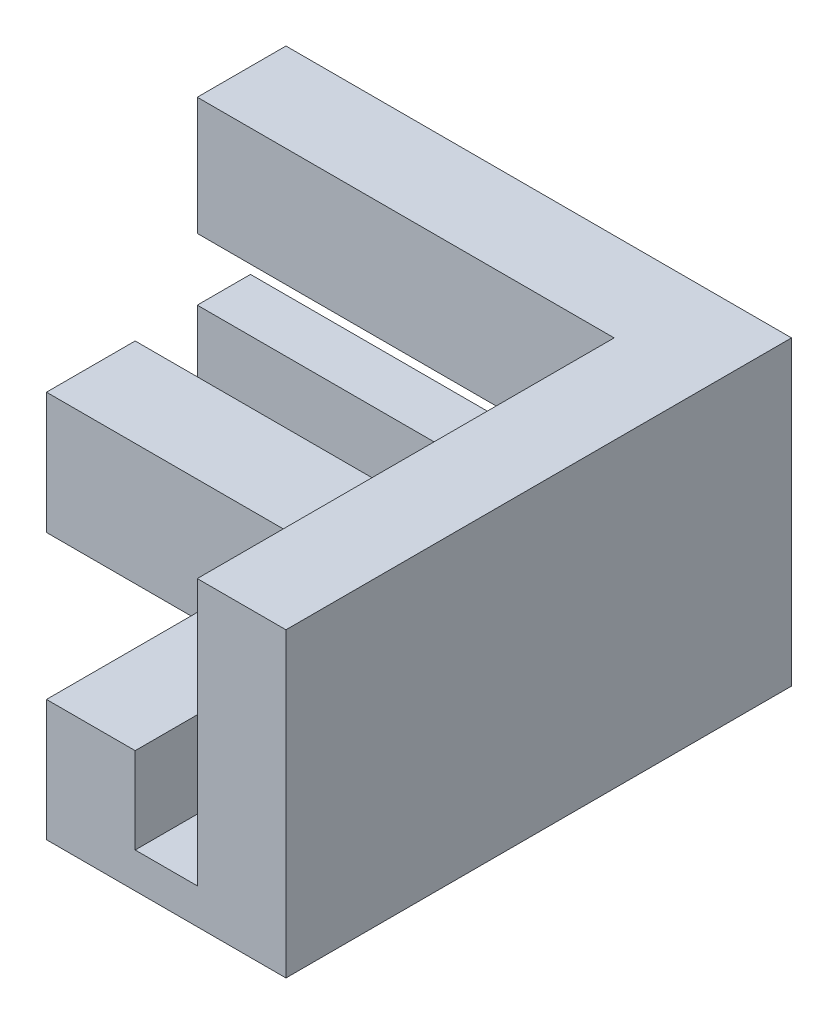
ISO-10303-21;
HEADER;
FILE_DESCRIPTION(('STEP AP214'),'2;1');
FILE_NAME('part.step','',(''),(''),'','','');
FILE_SCHEMA(('AUTOMOTIVE_DESIGN { 1 0 10303 214 1 1 1 1 }'));
ENDSEC;
DATA;
#1=APPLICATION_CONTEXT('core data for automotive mechanical design processes');
#2=APPLICATION_PROTOCOL_DEFINITION('international standard','automotive_design',2000,#1);
#3=PRODUCT_CONTEXT('',#1,'mechanical');
#4=PRODUCT('Part','Part','',(#3));
#5=PRODUCT_RELATED_PRODUCT_CATEGORY('part','',(#4));
#6=PRODUCT_DEFINITION_FORMATION('','',#4);
#7=PRODUCT_DEFINITION_CONTEXT('part definition',#1,'design');
#8=PRODUCT_DEFINITION('design','',#6,#7);
#9=PRODUCT_DEFINITION_SHAPE('','',#8);
#10=(LENGTH_UNIT() NAMED_UNIT(*) SI_UNIT(.MILLI.,.METRE.));
#11=(NAMED_UNIT(*) PLANE_ANGLE_UNIT() SI_UNIT($,.RADIAN.));
#12=(NAMED_UNIT(*) SI_UNIT($,.STERADIAN.) SOLID_ANGLE_UNIT());
#13=UNCERTAINTY_MEASURE_WITH_UNIT(LENGTH_MEASURE(1.E-05),#10,'distance_accuracy_value','');
#14=(GEOMETRIC_REPRESENTATION_CONTEXT(3) GLOBAL_UNCERTAINTY_ASSIGNED_CONTEXT((#13)) GLOBAL_UNIT_ASSIGNED_CONTEXT((#10,
#11,#12)) REPRESENTATION_CONTEXT('',''));
#15=CARTESIAN_POINT('',(0.,0.,0.));
#16=DIRECTION('',(0.,0.,1.));
#17=DIRECTION('',(1.,0.,0.));
#18=AXIS2_PLACEMENT_3D('',#15,#16,#17);
#19=CARTESIAN_POINT('',(-5.,15.,-9.39173583771506));
#20=DIRECTION('',(1.,0.,0.));
#21=DIRECTION('',(0.,0.,-1.));
#22=AXIS2_PLACEMENT_3D('',#19,#20,#21);
#23=PLANE('',#22);
#24=DIRECTION('',(0.,-1.,0.));
#25=VECTOR('',#24,1.);
#26=CARTESIAN_POINT('',(-5.,15.,-9.39173583771506));
#27=LINE('',#26,#25);
#28=CARTESIAN_POINT('',(-5.,15.,-9.39173583771506));
#29=VERTEX_POINT('',#28);
#30=CARTESIAN_POINT('',(-5.,10.35,-9.39173583771506));
#31=VERTEX_POINT('',#30);
#32=EDGE_CURVE('E239',#29,#31,#27,.T.);
#33=ORIENTED_EDGE('',*,*,#32,.T.);
#34=DIRECTION('',(0.,0.707106781186546,-0.707106781186549));
#35=VECTOR('',#34,1.);
#36=CARTESIAN_POINT('',(-5.,10.35,-9.39173583771506));
#37=LINE('',#36,#35);
#38=CARTESIAN_POINT('',(-5.,8.35,-7.39173583771505));
#39=VERTEX_POINT('',#38);
#40=EDGE_CURVE('E69',#31,#39,#37,.F.);
#41=ORIENTED_EDGE('',*,*,#40,.T.);
#42=DIRECTION('',(0.,0.,1.));
#43=VECTOR('',#42,1.);
#44=CARTESIAN_POINT('',(-5.,8.35,-9.39173583771506));
#45=LINE('',#44,#43);
#46=CARTESIAN_POINT('',(-5.,8.35,-4.39173583771506));
#47=VERTEX_POINT('',#46);
#48=EDGE_CURVE('E372',#39,#47,#45,.T.);
#49=ORIENTED_EDGE('',*,*,#48,.T.);
#50=DIRECTION('',(0.,1.,0.));
#51=VECTOR('',#50,1.);
#52=CARTESIAN_POINT('',(-5.,-33.2340187157677,-4.39173583771506));
#53=LINE('',#52,#51);
#54=CARTESIAN_POINT('',(-5.,15.,-4.39173583771506));
#55=VERTEX_POINT('',#54);
#56=EDGE_CURVE('E346',#47,#55,#53,.T.);
#57=ORIENTED_EDGE('',*,*,#56,.T.);
#58=DIRECTION('',(0.,0.,1.));
#59=VECTOR('',#58,1.);
#60=CARTESIAN_POINT('',(-5.,15.,-9.39173583771506));
#61=LINE('',#60,#59);
#62=EDGE_CURVE('E219',#29,#55,#61,.T.);
#63=ORIENTED_EDGE('',*,*,#62,.F.);
#64=EDGE_LOOP('',(#33,#41,#49,#57,#63));
#65=FACE_BOUND('',#64,.T.);
#66=ADVANCED_FACE('F44',(#65),#23,.F.);
#67=CARTESIAN_POINT('',(18.5,15.,-4.39173583771506));
#68=DIRECTION('',(0.,0.,1.));
#69=DIRECTION('',(1.,0.,0.));
#70=AXIS2_PLACEMENT_3D('',#67,#68,#69);
#71=PLANE('',#70);
#72=DIRECTION('',(-1.,0.,0.));
#73=VECTOR('',#72,1.);
#74=CARTESIAN_POINT('',(18.5,8.35,-4.39173583771506));
#75=LINE('',#74,#73);
#76=CARTESIAN_POINT('',(18.5,8.35,-4.39173583771506));
#77=VERTEX_POINT('',#76);
#78=EDGE_CURVE('E383',#77,#47,#75,.T.);
#79=ORIENTED_EDGE('',*,*,#78,.F.);
#80=DIRECTION('',(0.,-1.,0.));
#81=VECTOR('',#80,1.);
#82=CARTESIAN_POINT('',(18.5,15.,-4.39173583771506));
#83=LINE('',#82,#81);
#84=CARTESIAN_POINT('',(18.5,15.,-4.39173583771506));
#85=VERTEX_POINT('',#84);
#86=EDGE_CURVE('E197',#85,#77,#83,.T.);
#87=ORIENTED_EDGE('',*,*,#86,.F.);
#88=DIRECTION('',(-1.,0.,0.));
#89=VECTOR('',#88,1.);
#90=CARTESIAN_POINT('',(18.5,15.,-4.39173583771506));
#91=LINE('',#90,#89);
#92=EDGE_CURVE('E204',#85,#55,#91,.T.);
#93=ORIENTED_EDGE('',*,*,#92,.T.);
#94=ORIENTED_EDGE('',*,*,#56,.F.);
#95=EDGE_LOOP('',(#79,#87,#93,#94));
#96=FACE_BOUND('',#95,.T.);
#97=ADVANCED_FACE('F403',(#96),#71,.T.);
#98=CARTESIAN_POINT('',(-5.,15.,4.10826416228494));
#99=DIRECTION('',(0.,0.,-1.));
#100=DIRECTION('',(-1.,0.,0.));
#101=AXIS2_PLACEMENT_3D('',#98,#99,#100);
#102=PLANE('',#101);
#103=DIRECTION('',(-1.,0.,0.));
#104=VECTOR('',#103,1.);
#105=CARTESIAN_POINT('',(-5.,4.85,4.10826416228494));
#106=LINE('',#105,#104);
#107=CARTESIAN_POINT('',(10.,4.85,4.10826416228494));
#108=VERTEX_POINT('',#107);
#109=CARTESIAN_POINT('',(-5.,4.85,4.10826416228494));
#110=VERTEX_POINT('',#109);
#111=EDGE_CURVE('E344',#108,#110,#106,.T.);
#112=ORIENTED_EDGE('',*,*,#111,.T.);
#113=DIRECTION('',(0.,-1.,0.));
#114=VECTOR('',#113,1.);
#115=CARTESIAN_POINT('',(-5.,15.,4.10826416228494));
#116=LINE('',#115,#114);
#117=CARTESIAN_POINT('',(-5.,-2.,4.10826416228494));
#118=VERTEX_POINT('',#117);
#119=EDGE_CURVE('E235',#110,#118,#116,.T.);
#120=ORIENTED_EDGE('',*,*,#119,.T.);
#121=DIRECTION('',(-1.,0.,0.));
#122=VECTOR('',#121,1.);
#123=CARTESIAN_POINT('',(-5.,-2.,4.10826416228494));
#124=LINE('',#123,#122);
#125=CARTESIAN_POINT('',(10.,-2.,4.10826416228494));
#126=VERTEX_POINT('',#125);
#127=EDGE_CURVE('E289',#126,#118,#124,.T.);
#128=ORIENTED_EDGE('',*,*,#127,.F.);
#129=DIRECTION('',(0.,-1.,0.));
#130=VECTOR('',#129,1.);
#131=CARTESIAN_POINT('',(10.,15.,4.10826416228494));
#132=LINE('',#131,#130);
#133=EDGE_CURVE('E232',#108,#126,#132,.T.);
#134=ORIENTED_EDGE('',*,*,#133,.F.);
#135=EDGE_LOOP('',(#112,#120,#128,#134));
#136=FACE_BOUND('',#135,.T.);
#137=ADVANCED_FACE('F408',(#136),#102,.F.);
#138=CARTESIAN_POINT('',(10.,15.,4.10826416228494));
#139=DIRECTION('',(1.,0.,0.));
#140=DIRECTION('',(0.,0.,-1.));
#141=AXIS2_PLACEMENT_3D('',#138,#139,#140);
#142=PLANE('',#141);
#143=DIRECTION('',(0.,0.,-1.));
#144=VECTOR('',#143,1.);
#145=CARTESIAN_POINT('',(10.,4.85,4.10826416228494));
#146=LINE('',#145,#144);
#147=CARTESIAN_POINT('',(10.,4.85,19.1082641622849));
#148=VERTEX_POINT('',#147);
#149=EDGE_CURVE('E355',#148,#108,#146,.T.);
#150=ORIENTED_EDGE('',*,*,#149,.T.);
#151=ORIENTED_EDGE('',*,*,#133,.T.);
#152=DIRECTION('',(0.,0.,-1.));
#153=VECTOR('',#152,1.);
#154=CARTESIAN_POINT('',(10.,-2.,4.10826416228494));
#155=LINE('',#154,#153);
#156=CARTESIAN_POINT('',(10.,-2.,19.1082641622849));
#157=VERTEX_POINT('',#156);
#158=EDGE_CURVE('E305',#157,#126,#155,.T.);
#159=ORIENTED_EDGE('',*,*,#158,.F.);
#160=DIRECTION('',(0.,-1.,0.));
#161=VECTOR('',#160,1.);
#162=CARTESIAN_POINT('',(10.,15.,19.1082641622849));
#163=LINE('',#162,#161);
#164=EDGE_CURVE('E229',#148,#157,#163,.T.);
#165=ORIENTED_EDGE('',*,*,#164,.F.);
#166=EDGE_LOOP('',(#150,#151,#159,#165));
#167=FACE_BOUND('',#166,.T.);
#168=ADVANCED_FACE('F440',(#167),#142,.F.);
#169=CARTESIAN_POINT('',(0.,15.,-0.891735837715059));
#170=DIRECTION('',(0.,0.,-1.));
#171=DIRECTION('',(-1.,0.,0.));
#172=AXIS2_PLACEMENT_3D('',#169,#170,#171);
#173=PLANE('',#172);
#174=DIRECTION('',(1.,0.,0.));
#175=VECTOR('',#174,1.);
#176=CARTESIAN_POINT('',(0.,0.,-0.891735837715059));
#177=LINE('',#176,#175);
#178=CARTESIAN_POINT('',(-5.,0.,-0.891735837715057));
#179=VERTEX_POINT('',#178);
#180=CARTESIAN_POINT('',(15.,0.,-0.891735837715059));
#181=VERTEX_POINT('',#180);
#182=EDGE_CURVE('E315',#179,#181,#177,.T.);
#183=ORIENTED_EDGE('',*,*,#182,.F.);
#184=DIRECTION('',(0.,1.,0.));
#185=VECTOR('',#184,1.);
#186=CARTESIAN_POINT('',(-5.,-33.2340187157677,-0.891735837715057));
#187=LINE('',#186,#185);
#188=CARTESIAN_POINT('',(-5.,4.85,-0.891735837715058));
#189=VERTEX_POINT('',#188);
#190=EDGE_CURVE('E367',#179,#189,#187,.T.);
#191=ORIENTED_EDGE('',*,*,#190,.T.);
#192=DIRECTION('',(1.,0.,0.));
#193=VECTOR('',#192,1.);
#194=CARTESIAN_POINT('',(0.,4.85,-0.891735837715059));
#195=LINE('',#194,#193);
#196=CARTESIAN_POINT('',(15.,4.85,-0.891735837715059));
#197=VERTEX_POINT('',#196);
#198=EDGE_CURVE('E291',#189,#197,#195,.T.);
#199=ORIENTED_EDGE('',*,*,#198,.T.);
#200=DIRECTION('',(0.,-1.,0.));
#201=VECTOR('',#200,1.);
#202=CARTESIAN_POINT('',(15.,15.,-0.891735837715059));
#203=LINE('',#202,#201);
#204=EDGE_CURVE('E203',#197,#181,#203,.T.);
#205=ORIENTED_EDGE('',*,*,#204,.T.);
#206=EDGE_LOOP('',(#183,#191,#199,#205));
#207=FACE_BOUND('',#206,.T.);
#208=ADVANCED_FACE('F446',(#207),#173,.T.);
#209=CARTESIAN_POINT('',(15.,15.,-0.891735837715059));
#210=DIRECTION('',(1.,0.,0.));
#211=DIRECTION('',(0.,0.,-1.));
#212=AXIS2_PLACEMENT_3D('',#209,#210,#211);
#213=PLANE('',#212);
#214=ORIENTED_EDGE('',*,*,#204,.F.);
#215=DIRECTION('',(0.,0.,1.));
#216=VECTOR('',#215,1.);
#217=CARTESIAN_POINT('',(15.,4.85,-0.891735837715059));
#218=LINE('',#217,#216);
#219=CARTESIAN_POINT('',(15.,4.85,19.1082641622849));
#220=VERTEX_POINT('',#219);
#221=EDGE_CURVE('E295',#197,#220,#218,.T.);
#222=ORIENTED_EDGE('',*,*,#221,.T.);
#223=DIRECTION('',(0.,1.,0.));
#224=VECTOR('',#223,1.);
#225=CARTESIAN_POINT('',(15.,-33.2340187157677,19.1082641622849));
#226=LINE('',#225,#224);
#227=CARTESIAN_POINT('',(15.,0.,19.1082641622849));
#228=VERTEX_POINT('',#227);
#229=EDGE_CURVE('E371',#228,#220,#226,.T.);
#230=ORIENTED_EDGE('',*,*,#229,.F.);
#231=DIRECTION('',(0.,0.,1.));
#232=VECTOR('',#231,1.);
#233=CARTESIAN_POINT('',(15.,0.,-0.891735837715059));
#234=LINE('',#233,#232);
#235=EDGE_CURVE('E318',#181,#228,#234,.T.);
#236=ORIENTED_EDGE('',*,*,#235,.F.);
#237=EDGE_LOOP('',(#214,#222,#230,#236));
#238=FACE_BOUND('',#237,.T.);
#239=ADVANCED_FACE('F434',(#238),#213,.T.);
#240=CARTESIAN_POINT('',(0.,15.,0.));
#241=DIRECTION('',(0.,1.,0.));
#242=DIRECTION('',(0.,0.,1.));
#243=AXIS2_PLACEMENT_3D('',#240,#241,#242);
#244=PLANE('',#243);
#245=DIRECTION('',(0.,0.,-1.));
#246=VECTOR('',#245,1.);
#247=CARTESIAN_POINT('',(18.5,15.,14.1082641622849));
#248=LINE('',#247,#246);
#249=CARTESIAN_POINT('',(18.5,15.,19.1082641622849));
#250=VERTEX_POINT('',#249);
#251=EDGE_CURVE('E198',#250,#85,#248,.T.);
#252=ORIENTED_EDGE('',*,*,#251,.F.);
#253=DIRECTION('',(1.,0.,0.));
#254=VECTOR('',#253,1.);
#255=CARTESIAN_POINT('',(10.,15.,19.1082641622849));
#256=LINE('',#255,#254);
#257=CARTESIAN_POINT('',(23.5,15.,19.1082641622849));
#258=VERTEX_POINT('',#257);
#259=EDGE_CURVE('E223',#250,#258,#256,.T.);
#260=ORIENTED_EDGE('',*,*,#259,.T.);
#261=DIRECTION('',(0.,0.,-1.));
#262=VECTOR('',#261,1.);
#263=CARTESIAN_POINT('',(23.5,15.,19.1082641622849));
#264=LINE('',#263,#262);
#265=CARTESIAN_POINT('',(23.5,15.,-9.39173583771506));
#266=VERTEX_POINT('',#265);
#267=EDGE_CURVE('E212',#258,#266,#264,.T.);
#268=ORIENTED_EDGE('',*,*,#267,.T.);
#269=DIRECTION('',(-1.,0.,0.));
#270=VECTOR('',#269,1.);
#271=CARTESIAN_POINT('',(23.5,15.,-9.39173583771506));
#272=LINE('',#271,#270);
#273=EDGE_CURVE('E216',#266,#29,#272,.T.);
#274=ORIENTED_EDGE('',*,*,#273,.T.);
#275=ORIENTED_EDGE('',*,*,#62,.T.);
#276=ORIENTED_EDGE('',*,*,#92,.F.);
#277=EDGE_LOOP('',(#252,#260,#268,#274,#275,#276));
#278=FACE_BOUND('',#277,.T.);
#279=ADVANCED_FACE('F423',(#278),#244,.T.);
#280=CARTESIAN_POINT('',(23.5,15.,19.1082641622849));
#281=DIRECTION('',(-1.,0.,0.));
#282=DIRECTION('',(0.,0.,1.));
#283=AXIS2_PLACEMENT_3D('',#280,#281,#282);
#284=PLANE('',#283);
#285=DIRECTION('',(0.,-1.,0.));
#286=VECTOR('',#285,1.);
#287=CARTESIAN_POINT('',(23.5,15.,19.1082641622849));
#288=LINE('',#287,#286);
#289=CARTESIAN_POINT('',(23.5,-2.,19.1082641622849));
#290=VERTEX_POINT('',#289);
#291=EDGE_CURVE('E226',#258,#290,#288,.T.);
#292=ORIENTED_EDGE('',*,*,#291,.T.);
#293=DIRECTION('',(0.,0.,1.));
#294=VECTOR('',#293,1.);
#295=CARTESIAN_POINT('',(23.5,-2.,19.1082641622849));
#296=LINE('',#295,#294);
#297=CARTESIAN_POINT('',(23.5,-2.,-9.39173583771506));
#298=VERTEX_POINT('',#297);
#299=EDGE_CURVE('E283',#298,#290,#296,.T.);
#300=ORIENTED_EDGE('',*,*,#299,.F.);
#301=DIRECTION('',(0.,-1.,0.));
#302=VECTOR('',#301,1.);
#303=CARTESIAN_POINT('',(23.5,15.,-9.39173583771506));
#304=LINE('',#303,#302);
#305=EDGE_CURVE('E242',#266,#298,#304,.T.);
#306=ORIENTED_EDGE('',*,*,#305,.F.);
#307=ORIENTED_EDGE('',*,*,#267,.F.);
#308=EDGE_LOOP('',(#292,#300,#306,#307));
#309=FACE_BOUND('',#308,.T.);
#310=ADVANCED_FACE('F419',(#309),#284,.F.);
#311=CARTESIAN_POINT('',(23.5,15.,-9.39173583771506));
#312=DIRECTION('',(0.,0.,1.));
#313=DIRECTION('',(1.,0.,0.));
#314=AXIS2_PLACEMENT_3D('',#311,#312,#313);
#315=PLANE('',#314);
#316=CARTESIAN_POINT('',(-5.,2.84999999999999,-9.39173583771506));
#317=VERTEX_POINT('',#316);
#318=CARTESIAN_POINT('',(-5.,-2.,-9.39173583771506));
#319=VERTEX_POINT('',#318);
#320=EDGE_CURVE('E238',#317,#319,#27,.T.);
#321=ORIENTED_EDGE('',*,*,#320,.F.);
#322=DIRECTION('',(1.,0.,0.));
#323=VECTOR('',#322,1.);
#324=CARTESIAN_POINT('',(23.5,2.84999999999999,-9.39173583771506));
#325=LINE('',#324,#323);
#326=CARTESIAN_POINT('',(18.5,2.85,-9.39173583771506));
#327=VERTEX_POINT('',#326);
#328=EDGE_CURVE('E249',#317,#327,#325,.T.);
#329=ORIENTED_EDGE('',*,*,#328,.T.);
#330=DIRECTION('',(0.,1.,0.));
#331=VECTOR('',#330,1.);
#332=CARTESIAN_POINT('',(18.5,4.85,-9.39173583771506));
#333=LINE('',#332,#331);
#334=CARTESIAN_POINT('',(18.5,10.35,-9.39173583771506));
#335=VERTEX_POINT('',#334);
#336=EDGE_CURVE('E181',#327,#335,#333,.T.);
#337=ORIENTED_EDGE('',*,*,#336,.T.);
#338=DIRECTION('',(-1.,0.,0.));
#339=VECTOR('',#338,1.);
#340=CARTESIAN_POINT('',(23.5,10.35,-9.39173583771506));
#341=LINE('',#340,#339);
#342=EDGE_CURVE('E245',#335,#31,#341,.T.);
#343=ORIENTED_EDGE('',*,*,#342,.T.);
#344=ORIENTED_EDGE('',*,*,#32,.F.);
#345=ORIENTED_EDGE('',*,*,#273,.F.);
#346=ORIENTED_EDGE('',*,*,#305,.T.);
#347=DIRECTION('',(1.,0.,0.));
#348=VECTOR('',#347,1.);
#349=CARTESIAN_POINT('',(23.5,-2.,-9.39173583771506));
#350=LINE('',#349,#348);
#351=EDGE_CURVE('E276',#319,#298,#350,.T.);
#352=ORIENTED_EDGE('',*,*,#351,.F.);
#353=EDGE_LOOP('',(#321,#329,#337,#343,#344,#345,#346,#352));
#354=FACE_BOUND('',#353,.T.);
#355=ADVANCED_FACE('F277',(#354),#315,.F.);
#356=DIRECTION('',(0.,0.,-1.));
#357=VECTOR('',#356,1.);
#358=CARTESIAN_POINT('',(-5.,4.85,-9.39173583771506));
#359=LINE('',#358,#357);
#360=CARTESIAN_POINT('',(-5.,4.85,-4.39173583771506));
#361=VERTEX_POINT('',#360);
#362=CARTESIAN_POINT('',(-5.,4.85,-7.39173583771505));
#363=VERTEX_POINT('',#362);
#364=EDGE_CURVE('E187',#361,#363,#359,.T.);
#365=ORIENTED_EDGE('',*,*,#364,.T.);
#366=DIRECTION('',(0.,0.707106781186546,0.707106781186549));
#367=VECTOR('',#366,1.);
#368=CARTESIAN_POINT('',(-5.,2.84999999999999,-9.39173583771506));
#369=LINE('',#368,#367);
#370=EDGE_CURVE('E256',#363,#317,#369,.F.);
#371=ORIENTED_EDGE('',*,*,#370,.T.);
#372=ORIENTED_EDGE('',*,*,#320,.T.);
#373=DIRECTION('',(0.,0.,-1.));
#374=VECTOR('',#373,1.);
#375=CARTESIAN_POINT('',(-5.,-2.,-9.39173583771506));
#376=LINE('',#375,#374);
#377=EDGE_CURVE('E271',#118,#319,#376,.T.);
#378=ORIENTED_EDGE('',*,*,#377,.F.);
#379=ORIENTED_EDGE('',*,*,#119,.F.);
#380=DIRECTION('',(0.,0.,-1.));
#381=VECTOR('',#380,1.);
#382=CARTESIAN_POINT('',(-5.,4.85,-0.891735837715059));
#383=LINE('',#382,#381);
#384=EDGE_CURVE('E338',#110,#189,#383,.T.);
#385=ORIENTED_EDGE('',*,*,#384,.T.);
#386=ORIENTED_EDGE('',*,*,#190,.F.);
#387=DIRECTION('',(0.,0.,-1.));
#388=VECTOR('',#387,1.);
#389=CARTESIAN_POINT('',(-5.,0.,-0.891735837715057));
#390=LINE('',#389,#388);
#391=CARTESIAN_POINT('',(-5.,0.,-4.39173583771506));
#392=VERTEX_POINT('',#391);
#393=EDGE_CURVE('E375',#179,#392,#390,.T.);
#394=ORIENTED_EDGE('',*,*,#393,.T.);
#395=EDGE_CURVE('E339',#392,#361,#53,.T.);
#396=ORIENTED_EDGE('',*,*,#395,.T.);
#397=EDGE_LOOP('',(#365,#371,#372,#378,#379,#385,#386,#394,#396));
#398=FACE_BOUND('',#397,.T.);
#399=ADVANCED_FACE('F268',(#398),#23,.F.);
#400=CARTESIAN_POINT('',(10.,15.,19.1082641622849));
#401=DIRECTION('',(0.,0.,-1.));
#402=DIRECTION('',(-1.,0.,0.));
#403=AXIS2_PLACEMENT_3D('',#400,#401,#402);
#404=PLANE('',#403);
#405=DIRECTION('',(0.,1.,0.));
#406=VECTOR('',#405,1.);
#407=CARTESIAN_POINT('',(18.5,-33.2340187157677,19.1082641622849));
#408=LINE('',#407,#406);
#409=CARTESIAN_POINT('',(18.5,0.,19.1082641622849));
#410=VERTEX_POINT('',#409);
#411=EDGE_CURVE('E330',#410,#250,#408,.T.);
#412=ORIENTED_EDGE('',*,*,#411,.F.);
#413=DIRECTION('',(-1.,0.,0.));
#414=VECTOR('',#413,1.);
#415=CARTESIAN_POINT('',(18.5,0.,19.1082641622849));
#416=LINE('',#415,#414);
#417=EDGE_CURVE('E328',#410,#228,#416,.T.);
#418=ORIENTED_EDGE('',*,*,#417,.T.);
#419=ORIENTED_EDGE('',*,*,#229,.T.);
#420=DIRECTION('',(-1.,0.,0.));
#421=VECTOR('',#420,1.);
#422=CARTESIAN_POINT('',(15.,4.85,19.1082641622849));
#423=LINE('',#422,#421);
#424=EDGE_CURVE('E349',#220,#148,#423,.T.);
#425=ORIENTED_EDGE('',*,*,#424,.T.);
#426=ORIENTED_EDGE('',*,*,#164,.T.);
#427=DIRECTION('',(-1.,0.,0.));
#428=VECTOR('',#427,1.);
#429=CARTESIAN_POINT('',(10.,-2.,19.1082641622849));
#430=LINE('',#429,#428);
#431=EDGE_CURVE('E301',#290,#157,#430,.T.);
#432=ORIENTED_EDGE('',*,*,#431,.F.);
#433=ORIENTED_EDGE('',*,*,#291,.F.);
#434=ORIENTED_EDGE('',*,*,#259,.F.);
#435=EDGE_LOOP('',(#412,#418,#419,#425,#426,#432,#433,#434));
#436=FACE_BOUND('',#435,.T.);
#437=ADVANCED_FACE('F334',(#436),#404,.F.);
#438=DIRECTION('',(1.,0.,0.));
#439=VECTOR('',#438,1.);
#440=CARTESIAN_POINT('',(18.5,4.85,-4.39173583771506));
#441=LINE('',#440,#439);
#442=CARTESIAN_POINT('',(18.5,4.85,-4.39173583771506));
#443=VERTEX_POINT('',#442);
#444=EDGE_CURVE('E184',#361,#443,#441,.T.);
#445=ORIENTED_EDGE('',*,*,#444,.F.);
#446=ORIENTED_EDGE('',*,*,#395,.F.);
#447=DIRECTION('',(-1.,0.,0.));
#448=VECTOR('',#447,1.);
#449=CARTESIAN_POINT('',(18.5,0.,-4.39173583771506));
#450=LINE('',#449,#448);
#451=CARTESIAN_POINT('',(18.5,0.,-4.39173583771506));
#452=VERTEX_POINT('',#451);
#453=EDGE_CURVE('E194',#452,#392,#450,.T.);
#454=ORIENTED_EDGE('',*,*,#453,.F.);
#455=EDGE_CURVE('E174',#443,#452,#83,.T.);
#456=ORIENTED_EDGE('',*,*,#455,.F.);
#457=EDGE_LOOP('',(#445,#446,#454,#456));
#458=FACE_BOUND('',#457,.T.);
#459=ADVANCED_FACE('F193',(#458),#71,.T.);
#460=CARTESIAN_POINT('',(18.5,15.,14.1082641622849));
#461=DIRECTION('',(-1.,0.,0.));
#462=DIRECTION('',(0.,0.,1.));
#463=AXIS2_PLACEMENT_3D('',#460,#461,#462);
#464=PLANE('',#463);
#465=ORIENTED_EDGE('',*,*,#411,.T.);
#466=ORIENTED_EDGE('',*,*,#251,.T.);
#467=ORIENTED_EDGE('',*,*,#86,.T.);
#468=DIRECTION('',(0.,0.,1.));
#469=VECTOR('',#468,1.);
#470=CARTESIAN_POINT('',(18.5,8.35,-9.39173583771506));
#471=LINE('',#470,#469);
#472=CARTESIAN_POINT('',(18.5,8.35,-7.39173583771505));
#473=VERTEX_POINT('',#472);
#474=EDGE_CURVE('E180',#473,#77,#471,.T.);
#475=ORIENTED_EDGE('',*,*,#474,.F.);
#476=DIRECTION('',(0.,-0.707106781186546,0.707106781186549));
#477=VECTOR('',#476,1.);
#478=CARTESIAN_POINT('',(18.5,10.35,-9.39173583771506));
#479=LINE('',#478,#477);
#480=EDGE_CURVE('E13',#473,#335,#479,.F.);
#481=ORIENTED_EDGE('',*,*,#480,.T.);
#482=ORIENTED_EDGE('',*,*,#336,.F.);
#483=DIRECTION('',(0.,-0.707106781186546,-0.707106781186549));
#484=VECTOR('',#483,1.);
#485=CARTESIAN_POINT('',(18.5,2.84999999999999,-9.39173583771506));
#486=LINE('',#485,#484);
#487=CARTESIAN_POINT('',(18.5,4.85,-7.39173583771505));
#488=VERTEX_POINT('',#487);
#489=EDGE_CURVE('E54',#327,#488,#486,.F.);
#490=ORIENTED_EDGE('',*,*,#489,.T.);
#491=DIRECTION('',(0.,0.,1.));
#492=VECTOR('',#491,1.);
#493=CARTESIAN_POINT('',(18.5,4.85,-9.39173583771506));
#494=LINE('',#493,#492);
#495=EDGE_CURVE('E170',#488,#443,#494,.T.);
#496=ORIENTED_EDGE('',*,*,#495,.T.);
#497=ORIENTED_EDGE('',*,*,#455,.T.);
#498=DIRECTION('',(0.,0.,-1.));
#499=VECTOR('',#498,1.);
#500=CARTESIAN_POINT('',(18.5,0.,14.1082641622849));
#501=LINE('',#500,#499);
#502=EDGE_CURVE('E208',#410,#452,#501,.T.);
#503=ORIENTED_EDGE('',*,*,#502,.F.);
#504=EDGE_LOOP('',(#465,#466,#467,#475,#481,#482,#490,#496,#497,#503));
#505=FACE_BOUND('',#504,.T.);
#506=ADVANCED_FACE('F172',(#505),#464,.T.);
#507=CARTESIAN_POINT('',(0.,0.,0.));
#508=DIRECTION('',(0.,1.,0.));
#509=DIRECTION('',(0.,0.,1.));
#510=AXIS2_PLACEMENT_3D('',#507,#508,#509);
#511=PLANE('',#510);
#512=ORIENTED_EDGE('',*,*,#502,.T.);
#513=ORIENTED_EDGE('',*,*,#453,.T.);
#514=ORIENTED_EDGE('',*,*,#393,.F.);
#515=ORIENTED_EDGE('',*,*,#182,.T.);
#516=ORIENTED_EDGE('',*,*,#235,.T.);
#517=ORIENTED_EDGE('',*,*,#417,.F.);
#518=EDGE_LOOP('',(#512,#513,#514,#515,#516,#517));
#519=FACE_BOUND('',#518,.T.);
#520=ADVANCED_FACE('F325',(#519),#511,.T.);
#521=CARTESIAN_POINT('',(0.,-2.,0.));
#522=DIRECTION('',(0.,1.,0.));
#523=DIRECTION('',(0.,0.,1.));
#524=AXIS2_PLACEMENT_3D('',#521,#522,#523);
#525=PLANE('',#524);
#526=ORIENTED_EDGE('',*,*,#377,.T.);
#527=ORIENTED_EDGE('',*,*,#351,.T.);
#528=ORIENTED_EDGE('',*,*,#299,.T.);
#529=ORIENTED_EDGE('',*,*,#431,.T.);
#530=ORIENTED_EDGE('',*,*,#158,.T.);
#531=ORIENTED_EDGE('',*,*,#127,.T.);
#532=EDGE_LOOP('',(#526,#527,#528,#529,#530,#531));
#533=FACE_BOUND('',#532,.T.);
#534=ADVANCED_FACE('F286',(#533),#525,.F.);
#535=CARTESIAN_POINT('',(0.,4.85,0.));
#536=DIRECTION('',(0.,1.,0.));
#537=DIRECTION('',(0.,0.,1.));
#538=AXIS2_PLACEMENT_3D('',#535,#536,#537);
#539=PLANE('',#538);
#540=ORIENTED_EDGE('',*,*,#424,.F.);
#541=ORIENTED_EDGE('',*,*,#221,.F.);
#542=ORIENTED_EDGE('',*,*,#198,.F.);
#543=ORIENTED_EDGE('',*,*,#384,.F.);
#544=ORIENTED_EDGE('',*,*,#111,.F.);
#545=ORIENTED_EDGE('',*,*,#149,.F.);
#546=EDGE_LOOP('',(#540,#541,#542,#543,#544,#545));
#547=FACE_BOUND('',#546,.T.);
#548=ADVANCED_FACE('F444',(#547),#539,.T.);
#549=CARTESIAN_POINT('',(18.5,8.35,-9.39173583771506));
#550=DIRECTION('',(0.,1.,0.));
#551=DIRECTION('',(-1.,0.,0.));
#552=AXIS2_PLACEMENT_3D('',#549,#550,#551);
#553=PLANE('',#552);
#554=ORIENTED_EDGE('',*,*,#48,.F.);
#555=DIRECTION('',(1.,0.,0.));
#556=VECTOR('',#555,1.);
#557=CARTESIAN_POINT('',(18.5,8.35,-7.39173583771505));
#558=LINE('',#557,#556);
#559=EDGE_CURVE('E61',#39,#473,#558,.T.);
#560=ORIENTED_EDGE('',*,*,#559,.T.);
#561=ORIENTED_EDGE('',*,*,#474,.T.);
#562=ORIENTED_EDGE('',*,*,#78,.T.);
#563=EDGE_LOOP('',(#554,#560,#561,#562));
#564=FACE_BOUND('',#563,.T.);
#565=ADVANCED_FACE('F502',(#564),#553,.F.);
#566=CARTESIAN_POINT('',(-5.,4.85,-9.39173583771506));
#567=DIRECTION('',(0.,-1.,0.));
#568=DIRECTION('',(0.,0.,-1.));
#569=AXIS2_PLACEMENT_3D('',#566,#567,#568);
#570=PLANE('',#569);
#571=ORIENTED_EDGE('',*,*,#495,.F.);
#572=DIRECTION('',(-1.,0.,0.));
#573=VECTOR('',#572,1.);
#574=CARTESIAN_POINT('',(-5.,4.85,-7.39173583771505));
#575=LINE('',#574,#573);
#576=EDGE_CURVE('E253',#488,#363,#575,.T.);
#577=ORIENTED_EDGE('',*,*,#576,.T.);
#578=ORIENTED_EDGE('',*,*,#364,.F.);
#579=ORIENTED_EDGE('',*,*,#444,.T.);
#580=EDGE_LOOP('',(#571,#577,#578,#579));
#581=FACE_BOUND('',#580,.T.);
#582=ADVANCED_FACE('F185',(#581),#570,.F.);
#583=CARTESIAN_POINT('',(23.5,2.84999999999999,-9.39173583771506));
#584=DIRECTION('',(0.,-0.707106781186549,0.707106781186546));
#585=DIRECTION('',(1.,0.,0.));
#586=AXIS2_PLACEMENT_3D('',#583,#584,#585);
#587=PLANE('',#586);
#588=ORIENTED_EDGE('',*,*,#370,.F.);
#589=ORIENTED_EDGE('',*,*,#576,.F.);
#590=ORIENTED_EDGE('',*,*,#489,.F.);
#591=ORIENTED_EDGE('',*,*,#328,.F.);
#592=EDGE_LOOP('',(#588,#589,#590,#591));
#593=FACE_BOUND('',#592,.T.);
#594=ADVANCED_FACE('F397',(#593),#587,.F.);
#595=CARTESIAN_POINT('',(23.5,10.35,-9.39173583771506));
#596=DIRECTION('',(0.,0.707106781186549,0.707106781186546));
#597=DIRECTION('',(-1.,0.,0.));
#598=AXIS2_PLACEMENT_3D('',#595,#596,#597);
#599=PLANE('',#598);
#600=ORIENTED_EDGE('',*,*,#480,.F.);
#601=ORIENTED_EDGE('',*,*,#559,.F.);
#602=ORIENTED_EDGE('',*,*,#40,.F.);
#603=ORIENTED_EDGE('',*,*,#342,.F.);
#604=EDGE_LOOP('',(#600,#601,#602,#603));
#605=FACE_BOUND('',#604,.T.);
#606=ADVANCED_FACE('F47',(#605),#599,.F.);
#607=CLOSED_SHELL('',(#66,#97,#137,#168,#208,#239,#279,#310,#355,#399,#437,#459,#506,#520,#534,
#548,#565,#582,#594,#606));
#608=MANIFOLD_SOLID_BREP('B2',#607);
#609=ADVANCED_BREP_SHAPE_REPRESENTATION('',(#18,#608),#14);
#610=SHAPE_DEFINITION_REPRESENTATION(#9,#609);
ENDSEC;
END-ISO-10303-21;
